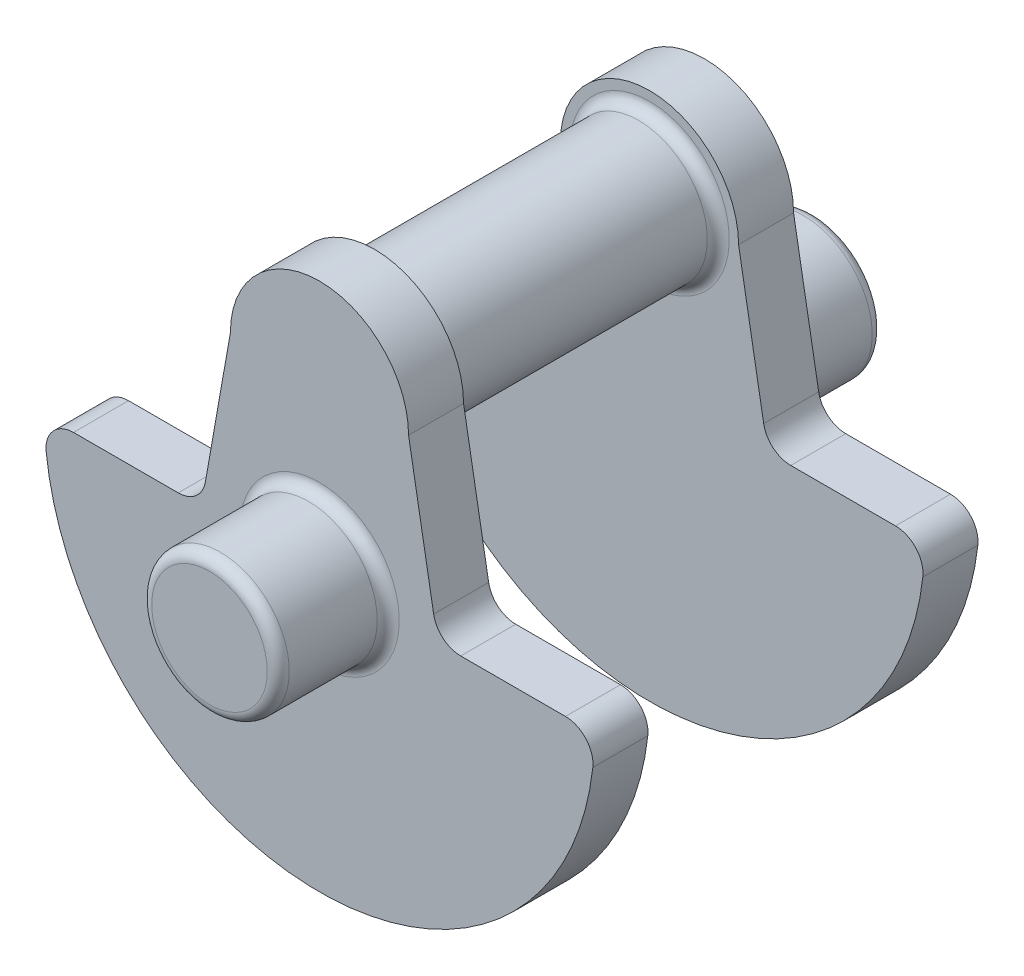
ISO-10303-21;
HEADER;
FILE_DESCRIPTION(('STEP AP214'),'2;1');
FILE_NAME('part.step','',(''),(''),'','','');
FILE_SCHEMA(('AUTOMOTIVE_DESIGN { 1 0 10303 214 1 1 1 1 }'));
ENDSEC;
DATA;
#1=APPLICATION_CONTEXT('core data for automotive mechanical design processes');
#2=APPLICATION_PROTOCOL_DEFINITION('international standard','automotive_design',2000,#1);
#3=PRODUCT_CONTEXT('',#1,'mechanical');
#4=PRODUCT('Part','Part','',(#3));
#5=PRODUCT_RELATED_PRODUCT_CATEGORY('part','',(#4));
#6=PRODUCT_DEFINITION_FORMATION('','',#4);
#7=PRODUCT_DEFINITION_CONTEXT('part definition',#1,'design');
#8=PRODUCT_DEFINITION('design','',#6,#7);
#9=PRODUCT_DEFINITION_SHAPE('','',#8);
#10=(LENGTH_UNIT() NAMED_UNIT(*) SI_UNIT(.MILLI.,.METRE.));
#11=(NAMED_UNIT(*) PLANE_ANGLE_UNIT() SI_UNIT($,.RADIAN.));
#12=(NAMED_UNIT(*) SI_UNIT($,.STERADIAN.) SOLID_ANGLE_UNIT());
#13=UNCERTAINTY_MEASURE_WITH_UNIT(LENGTH_MEASURE(1.E-05),#10,'distance_accuracy_value','');
#14=(GEOMETRIC_REPRESENTATION_CONTEXT(3) GLOBAL_UNCERTAINTY_ASSIGNED_CONTEXT((#13)) GLOBAL_UNIT_ASSIGNED_CONTEXT((#10,
#11,#12)) REPRESENTATION_CONTEXT('',''));
#15=CARTESIAN_POINT('',(0.,0.,0.));
#16=DIRECTION('',(0.,0.,1.));
#17=DIRECTION('',(1.,0.,0.));
#18=AXIS2_PLACEMENT_3D('',#15,#16,#17);
#19=CARTESIAN_POINT('',(0.,0.,-5.));
#20=DIRECTION('',(0.,0.,1.));
#21=DIRECTION('',(1.,0.,0.));
#22=AXIS2_PLACEMENT_3D('',#19,#20,#21);
#23=PLANE('',#22);
#24=CARTESIAN_POINT('',(0.,0.,-5.));
#25=DIRECTION('',(0.,0.,1.));
#26=DIRECTION('',(1.,0.,0.));
#27=AXIS2_PLACEMENT_3D('',#24,#25,#26);
#28=CIRCLE('',#27,14.5);
#29=CARTESIAN_POINT('',(14.5,0.,-5.));
#30=VERTEX_POINT('',#29);
#31=EDGE_CURVE('E340',#30,#30,#28,.T.);
#32=ORIENTED_EDGE('',*,*,#31,.T.);
#33=EDGE_LOOP('',(#32));
#34=FACE_BOUND('',#33,.T.);
#35=CARTESIAN_POINT('',(0.,-30.,-5.));
#36=DIRECTION('',(0.,0.,1.));
#37=DIRECTION('',(1.,0.,0.));
#38=AXIS2_PLACEMENT_3D('',#35,#36,#37);
#39=CIRCLE('',#38,50.);
#40=CARTESIAN_POINT('',(-49.6903994999953,-35.5555555555556,-5.));
#41=VERTEX_POINT('',#40);
#42=CARTESIAN_POINT('',(49.6903994999953,-35.5555555555556,-5.));
#43=VERTEX_POINT('',#42);
#44=EDGE_CURVE('E254',#41,#43,#39,.T.);
#45=ORIENTED_EDGE('',*,*,#44,.F.);
#46=CARTESIAN_POINT('',(-44.7213595499958,-35.,-5.));
#47=DIRECTION('',(0.,0.,1.));
#48=DIRECTION('',(1.,0.,0.));
#49=AXIS2_PLACEMENT_3D('',#46,#47,#48);
#50=CIRCLE('',#49,5.);
#51=CARTESIAN_POINT('',(-44.7213595499958,-30.,-5.));
#52=VERTEX_POINT('',#51);
#53=EDGE_CURVE('E293',#41,#52,#50,.F.);
#54=ORIENTED_EDGE('',*,*,#53,.T.);
#55=DIRECTION('',(-1.,0.,0.));
#56=VECTOR('',#55,1.);
#57=CARTESIAN_POINT('',(-50.,-30.,-5.));
#58=LINE('',#57,#56);
#59=CARTESIAN_POINT('',(-25.6794765631616,-30.,-5.));
#60=VERTEX_POINT('',#59);
#61=EDGE_CURVE('E251',#60,#52,#58,.T.);
#62=ORIENTED_EDGE('',*,*,#61,.F.);
#63=CARTESIAN_POINT('',(-25.6794765631616,-25.,-5.));
#64=DIRECTION('',(0.,0.,1.));
#65=DIRECTION('',(1.,0.,0.));
#66=AXIS2_PLACEMENT_3D('',#63,#64,#65);
#67=CIRCLE('',#66,5.);
#68=CARTESIAN_POINT('',(-20.7554377981006,-25.8682408883347,-5.));
#69=VERTEX_POINT('',#68);
#70=EDGE_CURVE('E323',#60,#69,#67,.T.);
#71=ORIENTED_EDGE('',*,*,#70,.T.);
#72=DIRECTION('',(-0.173648177666931,-0.984807753012208,0.));
#73=VECTOR('',#72,1.);
#74=CARTESIAN_POINT('',(-16.1941689860212,0.,-5.));
#75=LINE('',#74,#73);
#76=CARTESIAN_POINT('',(-16.1941689860212,0.,-5.));
#77=VERTEX_POINT('',#76);
#78=EDGE_CURVE('E248',#77,#69,#75,.T.);
#79=ORIENTED_EDGE('',*,*,#78,.F.);
#80=CARTESIAN_POINT('',(0.,0.,-5.));
#81=DIRECTION('',(0.,0.,1.));
#82=DIRECTION('',(1.,0.,0.));
#83=AXIS2_PLACEMENT_3D('',#80,#81,#82);
#84=CIRCLE('',#83,16.1941689860212);
#85=CARTESIAN_POINT('',(16.1941689860212,0.,-5.));
#86=VERTEX_POINT('',#85);
#87=EDGE_CURVE('E194',#86,#77,#84,.T.);
#88=ORIENTED_EDGE('',*,*,#87,.F.);
#89=DIRECTION('',(-0.173648177666931,0.984807753012208,0.));
#90=VECTOR('',#89,1.);
#91=CARTESIAN_POINT('',(16.1941689860212,0.,-5.));
#92=LINE('',#91,#90);
#93=CARTESIAN_POINT('',(20.7554377981006,-25.8682408883347,-5.));
#94=VERTEX_POINT('',#93);
#95=EDGE_CURVE('E232',#94,#86,#92,.T.);
#96=ORIENTED_EDGE('',*,*,#95,.F.);
#97=CARTESIAN_POINT('',(25.6794765631616,-25.,-5.));
#98=DIRECTION('',(0.,0.,1.));
#99=DIRECTION('',(1.,0.,0.));
#100=AXIS2_PLACEMENT_3D('',#97,#98,#99);
#101=CIRCLE('',#100,5.);
#102=CARTESIAN_POINT('',(25.6794765631616,-30.,-5.));
#103=VERTEX_POINT('',#102);
#104=EDGE_CURVE('E331',#94,#103,#101,.T.);
#105=ORIENTED_EDGE('',*,*,#104,.T.);
#106=DIRECTION('',(-1.,0.,0.));
#107=VECTOR('',#106,1.);
#108=CARTESIAN_POINT('',(21.4839784072752,-30.,-5.));
#109=LINE('',#108,#107);
#110=CARTESIAN_POINT('',(44.7213595499958,-30.,-5.));
#111=VERTEX_POINT('',#110);
#112=EDGE_CURVE('E257',#111,#103,#109,.T.);
#113=ORIENTED_EDGE('',*,*,#112,.F.);
#114=CARTESIAN_POINT('',(44.7213595499958,-35.,-5.));
#115=DIRECTION('',(0.,0.,1.));
#116=DIRECTION('',(1.,0.,0.));
#117=AXIS2_PLACEMENT_3D('',#114,#115,#116);
#118=CIRCLE('',#117,5.);
#119=EDGE_CURVE('E291',#111,#43,#118,.F.);
#120=ORIENTED_EDGE('',*,*,#119,.T.);
#121=EDGE_LOOP('',(#45,#54,#62,#71,#79,#88,#96,#105,#113,#120));
#122=FACE_BOUND('',#121,.T.);
#123=ADVANCED_FACE('F35',(#34,#122),#23,.F.);
#124=CARTESIAN_POINT('',(0.,0.,5.));
#125=DIRECTION('',(0.,0.,1.));
#126=DIRECTION('',(1.,0.,0.));
#127=AXIS2_PLACEMENT_3D('',#124,#125,#126);
#128=PLANE('',#127);
#129=CARTESIAN_POINT('',(0.,-30.,5.));
#130=DIRECTION('',(0.,0.,1.));
#131=DIRECTION('',(1.,0.,0.));
#132=AXIS2_PLACEMENT_3D('',#129,#130,#131);
#133=CIRCLE('',#132,14.5);
#134=CARTESIAN_POINT('',(14.5,-30.,5.));
#135=VERTEX_POINT('',#134);
#136=EDGE_CURVE('E11',#135,#135,#133,.F.);
#137=ORIENTED_EDGE('',*,*,#136,.T.);
#138=EDGE_LOOP('',(#137));
#139=FACE_BOUND('',#138,.T.);
#140=DIRECTION('',(-1.,0.,0.));
#141=VECTOR('',#140,1.);
#142=CARTESIAN_POINT('',(-50.,-30.,5.));
#143=LINE('',#142,#141);
#144=CARTESIAN_POINT('',(-25.6794765631616,-30.,5.));
#145=VERTEX_POINT('',#144);
#146=CARTESIAN_POINT('',(-44.7213595499958,-30.,5.));
#147=VERTEX_POINT('',#146);
#148=EDGE_CURVE('E235',#145,#147,#143,.T.);
#149=ORIENTED_EDGE('',*,*,#148,.T.);
#150=CARTESIAN_POINT('',(-44.7213595499958,-35.,5.));
#151=DIRECTION('',(0.,0.,1.));
#152=DIRECTION('',(1.,0.,0.));
#153=AXIS2_PLACEMENT_3D('',#150,#151,#152);
#154=CIRCLE('',#153,5.);
#155=CARTESIAN_POINT('',(-49.6903994999953,-35.5555555555556,5.));
#156=VERTEX_POINT('',#155);
#157=EDGE_CURVE('E302',#147,#156,#154,.T.);
#158=ORIENTED_EDGE('',*,*,#157,.T.);
#159=CARTESIAN_POINT('',(0.,-30.,5.));
#160=DIRECTION('',(0.,0.,1.));
#161=DIRECTION('',(1.,0.,0.));
#162=AXIS2_PLACEMENT_3D('',#159,#160,#161);
#163=CIRCLE('',#162,50.);
#164=CARTESIAN_POINT('',(49.6903994999953,-35.5555555555556,5.));
#165=VERTEX_POINT('',#164);
#166=EDGE_CURVE('E238',#156,#165,#163,.T.);
#167=ORIENTED_EDGE('',*,*,#166,.T.);
#168=CARTESIAN_POINT('',(44.7213595499958,-35.,5.));
#169=DIRECTION('',(0.,0.,1.));
#170=DIRECTION('',(1.,0.,0.));
#171=AXIS2_PLACEMENT_3D('',#168,#169,#170);
#172=CIRCLE('',#171,5.);
#173=CARTESIAN_POINT('',(44.7213595499958,-30.,5.));
#174=VERTEX_POINT('',#173);
#175=EDGE_CURVE('E300',#165,#174,#172,.T.);
#176=ORIENTED_EDGE('',*,*,#175,.T.);
#177=DIRECTION('',(-1.,0.,0.));
#178=VECTOR('',#177,1.);
#179=CARTESIAN_POINT('',(21.4839784072752,-30.,5.));
#180=LINE('',#179,#178);
#181=CARTESIAN_POINT('',(25.6794765631616,-30.,5.));
#182=VERTEX_POINT('',#181);
#183=EDGE_CURVE('E241',#174,#182,#180,.T.);
#184=ORIENTED_EDGE('',*,*,#183,.T.);
#185=CARTESIAN_POINT('',(25.6794765631616,-25.,5.));
#186=DIRECTION('',(0.,0.,1.));
#187=DIRECTION('',(1.,0.,0.));
#188=AXIS2_PLACEMENT_3D('',#185,#186,#187);
#189=CIRCLE('',#188,5.);
#190=CARTESIAN_POINT('',(20.7554377981006,-25.8682408883347,5.));
#191=VERTEX_POINT('',#190);
#192=EDGE_CURVE('E50',#182,#191,#189,.F.);
#193=ORIENTED_EDGE('',*,*,#192,.T.);
#194=DIRECTION('',(-0.173648177666931,0.984807753012208,0.));
#195=VECTOR('',#194,1.);
#196=CARTESIAN_POINT('',(16.1941689860212,0.,5.));
#197=LINE('',#196,#195);
#198=CARTESIAN_POINT('',(16.1941689860212,0.,5.));
#199=VERTEX_POINT('',#198);
#200=EDGE_CURVE('E243',#191,#199,#197,.T.);
#201=ORIENTED_EDGE('',*,*,#200,.T.);
#202=CARTESIAN_POINT('',(0.,0.,5.));
#203=DIRECTION('',(0.,0.,1.));
#204=DIRECTION('',(1.,0.,0.));
#205=AXIS2_PLACEMENT_3D('',#202,#203,#204);
#206=CIRCLE('',#205,16.1941689860212);
#207=CARTESIAN_POINT('',(-16.1941689860212,0.,5.));
#208=VERTEX_POINT('',#207);
#209=EDGE_CURVE('E228',#199,#208,#206,.T.);
#210=ORIENTED_EDGE('',*,*,#209,.T.);
#211=DIRECTION('',(-0.173648177666931,-0.984807753012208,0.));
#212=VECTOR('',#211,1.);
#213=CARTESIAN_POINT('',(-16.1941689860212,0.,5.));
#214=LINE('',#213,#212);
#215=CARTESIAN_POINT('',(-20.7554377981006,-25.8682408883347,5.));
#216=VERTEX_POINT('',#215);
#217=EDGE_CURVE('E231',#208,#216,#214,.T.);
#218=ORIENTED_EDGE('',*,*,#217,.T.);
#219=CARTESIAN_POINT('',(-25.6794765631616,-25.,5.));
#220=DIRECTION('',(0.,0.,1.));
#221=DIRECTION('',(1.,0.,0.));
#222=AXIS2_PLACEMENT_3D('',#219,#220,#221);
#223=CIRCLE('',#222,5.);
#224=EDGE_CURVE('E325',#216,#145,#223,.F.);
#225=ORIENTED_EDGE('',*,*,#224,.T.);
#226=EDGE_LOOP('',(#149,#158,#167,#176,#184,#193,#201,#210,#218,#225));
#227=FACE_BOUND('',#226,.T.);
#228=ADVANCED_FACE('F389',(#139,#227),#128,.T.);
#229=CARTESIAN_POINT('',(0.,0.,5.));
#230=DIRECTION('',(0.,0.,-1.));
#231=DIRECTION('',(-1.,0.,0.));
#232=AXIS2_PLACEMENT_3D('',#229,#230,#231);
#233=CYLINDRICAL_SURFACE('',#232,16.1941689860212);
#234=ORIENTED_EDGE('',*,*,#87,.T.);
#235=DIRECTION('',(0.,0.,-1.));
#236=VECTOR('',#235,1.);
#237=CARTESIAN_POINT('',(-16.1941689860212,0.,5.));
#238=LINE('',#237,#236);
#239=EDGE_CURVE('E262',#208,#77,#238,.T.);
#240=ORIENTED_EDGE('',*,*,#239,.F.);
#241=ORIENTED_EDGE('',*,*,#209,.F.);
#242=DIRECTION('',(0.,0.,-1.));
#243=VECTOR('',#242,1.);
#244=CARTESIAN_POINT('',(16.1941689860212,0.,5.));
#245=LINE('',#244,#243);
#246=EDGE_CURVE('E245',#199,#86,#245,.T.);
#247=ORIENTED_EDGE('',*,*,#246,.T.);
#248=EDGE_LOOP('',(#234,#240,#241,#247));
#249=FACE_BOUND('',#248,.T.);
#250=ADVANCED_FACE('F395',(#249),#233,.T.);
#251=CARTESIAN_POINT('',(-16.1941689860212,0.,5.));
#252=DIRECTION('',(0.984807753012208,-0.173648177666931,0.));
#253=DIRECTION('',(0.173648177666931,0.984807753012208,0.));
#254=AXIS2_PLACEMENT_3D('',#251,#252,#253);
#255=PLANE('',#254);
#256=ORIENTED_EDGE('',*,*,#78,.T.);
#257=DIRECTION('',(0.,0.,-1.));
#258=VECTOR('',#257,1.);
#259=CARTESIAN_POINT('',(-20.7554377981006,-25.8682408883347,5.));
#260=LINE('',#259,#258);
#261=EDGE_CURVE('E304',#69,#216,#260,.F.);
#262=ORIENTED_EDGE('',*,*,#261,.T.);
#263=ORIENTED_EDGE('',*,*,#217,.F.);
#264=ORIENTED_EDGE('',*,*,#239,.T.);
#265=EDGE_LOOP('',(#256,#262,#263,#264));
#266=FACE_BOUND('',#265,.T.);
#267=ADVANCED_FACE('F413',(#266),#255,.F.);
#268=CARTESIAN_POINT('',(-50.,-30.,5.));
#269=DIRECTION('',(0.,-1.,0.));
#270=DIRECTION('',(0.,0.,-1.));
#271=AXIS2_PLACEMENT_3D('',#268,#269,#270);
#272=PLANE('',#271);
#273=ORIENTED_EDGE('',*,*,#61,.T.);
#274=DIRECTION('',(0.,0.,-1.));
#275=VECTOR('',#274,1.);
#276=CARTESIAN_POINT('',(-44.7213595499958,-30.,5.));
#277=LINE('',#276,#275);
#278=EDGE_CURVE('E298',#52,#147,#277,.F.);
#279=ORIENTED_EDGE('',*,*,#278,.T.);
#280=ORIENTED_EDGE('',*,*,#148,.F.);
#281=DIRECTION('',(0.,0.,-1.));
#282=VECTOR('',#281,1.);
#283=CARTESIAN_POINT('',(-25.6794765631616,-30.,-5.));
#284=LINE('',#283,#282);
#285=EDGE_CURVE('E295',#145,#60,#284,.T.);
#286=ORIENTED_EDGE('',*,*,#285,.T.);
#287=EDGE_LOOP('',(#273,#279,#280,#286));
#288=FACE_BOUND('',#287,.T.);
#289=ADVANCED_FACE('F409',(#288),#272,.F.);
#290=CARTESIAN_POINT('',(0.,-30.,5.));
#291=DIRECTION('',(0.,0.,-1.));
#292=DIRECTION('',(-1.,0.,0.));
#293=AXIS2_PLACEMENT_3D('',#290,#291,#292);
#294=CYLINDRICAL_SURFACE('',#293,50.);
#295=ORIENTED_EDGE('',*,*,#166,.F.);
#296=DIRECTION('',(0.,0.,-1.));
#297=VECTOR('',#296,1.);
#298=CARTESIAN_POINT('',(-49.6903994999953,-35.5555555555556,5.));
#299=LINE('',#298,#297);
#300=EDGE_CURVE('E288',#156,#41,#299,.T.);
#301=ORIENTED_EDGE('',*,*,#300,.T.);
#302=ORIENTED_EDGE('',*,*,#44,.T.);
#303=DIRECTION('',(0.,0.,-1.));
#304=VECTOR('',#303,1.);
#305=CARTESIAN_POINT('',(49.6903994999953,-35.5555555555556,5.));
#306=LINE('',#305,#304);
#307=EDGE_CURVE('E286',#43,#165,#306,.F.);
#308=ORIENTED_EDGE('',*,*,#307,.T.);
#309=EDGE_LOOP('',(#295,#301,#302,#308));
#310=FACE_BOUND('',#309,.T.);
#311=ADVANCED_FACE('F406',(#310),#294,.T.);
#312=CARTESIAN_POINT('',(21.4839784072752,-30.,5.));
#313=DIRECTION('',(0.,-1.,0.));
#314=DIRECTION('',(1.,0.,0.));
#315=AXIS2_PLACEMENT_3D('',#312,#313,#314);
#316=PLANE('',#315);
#317=ORIENTED_EDGE('',*,*,#183,.F.);
#318=DIRECTION('',(0.,0.,-1.));
#319=VECTOR('',#318,1.);
#320=CARTESIAN_POINT('',(44.7213595499958,-30.,5.));
#321=LINE('',#320,#319);
#322=EDGE_CURVE('E313',#174,#111,#321,.T.);
#323=ORIENTED_EDGE('',*,*,#322,.T.);
#324=ORIENTED_EDGE('',*,*,#112,.T.);
#325=DIRECTION('',(0.,0.,-1.));
#326=VECTOR('',#325,1.);
#327=CARTESIAN_POINT('',(25.6794765631616,-30.,5.));
#328=LINE('',#327,#326);
#329=EDGE_CURVE('E58',#103,#182,#328,.F.);
#330=ORIENTED_EDGE('',*,*,#329,.T.);
#331=EDGE_LOOP('',(#317,#323,#324,#330));
#332=FACE_BOUND('',#331,.T.);
#333=ADVANCED_FACE('F402',(#332),#316,.F.);
#334=CARTESIAN_POINT('',(16.1941689860212,0.,5.));
#335=DIRECTION('',(-0.984807753012208,-0.173648177666931,0.));
#336=DIRECTION('',(0.173648177666931,-0.984807753012208,0.));
#337=AXIS2_PLACEMENT_3D('',#334,#335,#336);
#338=PLANE('',#337);
#339=ORIENTED_EDGE('',*,*,#200,.F.);
#340=DIRECTION('',(0.,0.,-1.));
#341=VECTOR('',#340,1.);
#342=CARTESIAN_POINT('',(20.7554377981006,-25.8682408883346,-5.));
#343=LINE('',#342,#341);
#344=EDGE_CURVE('E316',#191,#94,#343,.T.);
#345=ORIENTED_EDGE('',*,*,#344,.T.);
#346=ORIENTED_EDGE('',*,*,#95,.T.);
#347=ORIENTED_EDGE('',*,*,#246,.F.);
#348=EDGE_LOOP('',(#339,#345,#346,#347));
#349=FACE_BOUND('',#348,.T.);
#350=ADVANCED_FACE('F386',(#349),#338,.F.);
#351=CARTESIAN_POINT('',(0.,-30.,25.));
#352=DIRECTION('',(0.,0.,-1.));
#353=DIRECTION('',(-1.,0.,0.));
#354=AXIS2_PLACEMENT_3D('',#351,#352,#353);
#355=CYLINDRICAL_SURFACE('',#354,12.5);
#356=CARTESIAN_POINT('',(0.,-30.,23.));
#357=DIRECTION('',(0.,0.,1.));
#358=DIRECTION('',(1.,0.,0.));
#359=AXIS2_PLACEMENT_3D('',#356,#357,#358);
#360=CIRCLE('',#359,12.5);
#361=CARTESIAN_POINT('',(12.5,-30.,23.));
#362=VERTEX_POINT('',#361);
#363=EDGE_CURVE('E43',#362,#362,#360,.F.);
#364=ORIENTED_EDGE('',*,*,#363,.T.);
#365=EDGE_LOOP('',(#364));
#366=FACE_BOUND('',#365,.T.);
#367=CARTESIAN_POINT('',(0.,-30.,7.));
#368=DIRECTION('',(0.,0.,1.));
#369=DIRECTION('',(1.,0.,0.));
#370=AXIS2_PLACEMENT_3D('',#367,#368,#369);
#371=CIRCLE('',#370,12.5);
#372=CARTESIAN_POINT('',(12.5,-30.,7.));
#373=VERTEX_POINT('',#372);
#374=EDGE_CURVE('E361',#373,#373,#371,.T.);
#375=ORIENTED_EDGE('',*,*,#374,.T.);
#376=EDGE_LOOP('',(#375));
#377=FACE_BOUND('',#376,.T.);
#378=ADVANCED_FACE('F366',(#366,#377),#355,.T.);
#379=CARTESIAN_POINT('',(0.,-30.,25.));
#380=DIRECTION('',(0.,0.,1.));
#381=DIRECTION('',(1.,0.,0.));
#382=AXIS2_PLACEMENT_3D('',#379,#380,#381);
#383=PLANE('',#382);
#384=CARTESIAN_POINT('',(0.,-30.,25.));
#385=DIRECTION('',(0.,0.,1.));
#386=DIRECTION('',(1.,0.,0.));
#387=AXIS2_PLACEMENT_3D('',#384,#385,#386);
#388=CIRCLE('',#387,10.5);
#389=CARTESIAN_POINT('',(10.5,-30.,25.));
#390=VERTEX_POINT('',#389);
#391=EDGE_CURVE('E358',#390,#390,#388,.T.);
#392=ORIENTED_EDGE('',*,*,#391,.T.);
#393=EDGE_LOOP('',(#392));
#394=FACE_BOUND('',#393,.T.);
#395=ADVANCED_FACE('F375',(#394),#383,.T.);
#396=CARTESIAN_POINT('',(0.,0.,-55.));
#397=DIRECTION('',(0.,0.,1.));
#398=DIRECTION('',(1.,0.,0.));
#399=AXIS2_PLACEMENT_3D('',#396,#397,#398);
#400=CYLINDRICAL_SURFACE('',#399,12.5);
#401=CARTESIAN_POINT('',(0.,0.,-7.));
#402=DIRECTION('',(0.,0.,1.));
#403=DIRECTION('',(1.,0.,0.));
#404=AXIS2_PLACEMENT_3D('',#401,#402,#403);
#405=CIRCLE('',#404,12.5);
#406=CARTESIAN_POINT('',(12.5,0.,-7.));
#407=VERTEX_POINT('',#406);
#408=EDGE_CURVE('E337',#407,#407,#405,.F.);
#409=ORIENTED_EDGE('',*,*,#408,.T.);
#410=EDGE_LOOP('',(#409));
#411=FACE_BOUND('',#410,.T.);
#412=CARTESIAN_POINT('',(0.,0.,-53.));
#413=DIRECTION('',(0.,0.,-1.));
#414=DIRECTION('',(-1.,0.,0.));
#415=AXIS2_PLACEMENT_3D('',#412,#413,#414);
#416=CIRCLE('',#415,12.5);
#417=CARTESIAN_POINT('',(-12.5,0.,-53.));
#418=VERTEX_POINT('',#417);
#419=EDGE_CURVE('E334',#418,#418,#416,.F.);
#420=ORIENTED_EDGE('',*,*,#419,.T.);
#421=EDGE_LOOP('',(#420));
#422=FACE_BOUND('',#421,.T.);
#423=ADVANCED_FACE('F377',(#411,#422),#400,.T.);
#424=CARTESIAN_POINT('',(0.,0.,-55.));
#425=DIRECTION('',(0.,0.,-1.));
#426=DIRECTION('',(1.,0.,0.));
#427=AXIS2_PLACEMENT_3D('',#424,#425,#426);
#428=PLANE('',#427);
#429=CARTESIAN_POINT('',(0.,0.,-55.));
#430=DIRECTION('',(0.,0.,-1.));
#431=DIRECTION('',(-1.,0.,0.));
#432=AXIS2_PLACEMENT_3D('',#429,#430,#431);
#433=CIRCLE('',#432,14.5);
#434=CARTESIAN_POINT('',(-14.5,0.,-55.));
#435=VERTEX_POINT('',#434);
#436=EDGE_CURVE('E343',#435,#435,#433,.T.);
#437=ORIENTED_EDGE('',*,*,#436,.T.);
#438=EDGE_LOOP('',(#437));
#439=FACE_BOUND('',#438,.T.);
#440=DIRECTION('',(-1.,0.,0.));
#441=VECTOR('',#440,1.);
#442=CARTESIAN_POINT('',(-50.,-30.,-55.));
#443=LINE('',#442,#441);
#444=CARTESIAN_POINT('',(-25.6794765631616,-30.,-55.));
#445=VERTEX_POINT('',#444);
#446=CARTESIAN_POINT('',(-44.7213595499958,-30.,-55.));
#447=VERTEX_POINT('',#446);
#448=EDGE_CURVE('E204',#445,#447,#443,.T.);
#449=ORIENTED_EDGE('',*,*,#448,.T.);
#450=CARTESIAN_POINT('',(-44.7213595499958,-35.,-55.));
#451=DIRECTION('',(0.,0.,-1.));
#452=DIRECTION('',(-1.,0.,0.));
#453=AXIS2_PLACEMENT_3D('',#450,#451,#452);
#454=CIRCLE('',#453,5.);
#455=CARTESIAN_POINT('',(-49.6903994999953,-35.5555555555556,-55.));
#456=VERTEX_POINT('',#455);
#457=EDGE_CURVE('E275',#447,#456,#454,.F.);
#458=ORIENTED_EDGE('',*,*,#457,.T.);
#459=CARTESIAN_POINT('',(0.,-30.,-55.));
#460=DIRECTION('',(0.,0.,1.));
#461=DIRECTION('',(1.,0.,0.));
#462=AXIS2_PLACEMENT_3D('',#459,#460,#461);
#463=CIRCLE('',#462,50.);
#464=CARTESIAN_POINT('',(49.6903994999953,-35.5555555555556,-55.));
#465=VERTEX_POINT('',#464);
#466=EDGE_CURVE('E222',#456,#465,#463,.T.);
#467=ORIENTED_EDGE('',*,*,#466,.T.);
#468=CARTESIAN_POINT('',(44.7213595499958,-35.,-55.));
#469=DIRECTION('',(0.,0.,-1.));
#470=DIRECTION('',(-1.,0.,0.));
#471=AXIS2_PLACEMENT_3D('',#468,#469,#470);
#472=CIRCLE('',#471,5.);
#473=CARTESIAN_POINT('',(44.7213595499958,-30.,-55.));
#474=VERTEX_POINT('',#473);
#475=EDGE_CURVE('E273',#465,#474,#472,.F.);
#476=ORIENTED_EDGE('',*,*,#475,.T.);
#477=DIRECTION('',(-1.,0.,0.));
#478=VECTOR('',#477,1.);
#479=CARTESIAN_POINT('',(21.4839784072752,-30.,-55.));
#480=LINE('',#479,#478);
#481=CARTESIAN_POINT('',(25.6794765631616,-30.,-55.));
#482=VERTEX_POINT('',#481);
#483=EDGE_CURVE('E219',#474,#482,#480,.T.);
#484=ORIENTED_EDGE('',*,*,#483,.T.);
#485=CARTESIAN_POINT('',(25.6794765631616,-25.,-55.));
#486=DIRECTION('',(0.,0.,-1.));
#487=DIRECTION('',(-1.,0.,0.));
#488=AXIS2_PLACEMENT_3D('',#485,#486,#487);
#489=CIRCLE('',#488,5.);
#490=CARTESIAN_POINT('',(20.7554377981006,-25.8682408883347,-55.));
#491=VERTEX_POINT('',#490);
#492=EDGE_CURVE('E327',#482,#491,#489,.T.);
#493=ORIENTED_EDGE('',*,*,#492,.T.);
#494=DIRECTION('',(-0.173648177666931,0.984807753012208,0.));
#495=VECTOR('',#494,1.);
#496=CARTESIAN_POINT('',(16.1941689860212,0.,-55.));
#497=LINE('',#496,#495);
#498=CARTESIAN_POINT('',(16.1941689860212,0.,-55.));
#499=VERTEX_POINT('',#498);
#500=EDGE_CURVE('E217',#491,#499,#497,.T.);
#501=ORIENTED_EDGE('',*,*,#500,.T.);
#502=CARTESIAN_POINT('',(0.,0.,-55.));
#503=DIRECTION('',(0.,0.,1.));
#504=DIRECTION('',(1.,0.,0.));
#505=AXIS2_PLACEMENT_3D('',#502,#503,#504);
#506=CIRCLE('',#505,16.1941689860212);
#507=CARTESIAN_POINT('',(-16.1941689860212,0.,-55.));
#508=VERTEX_POINT('',#507);
#509=EDGE_CURVE('E193',#499,#508,#506,.T.);
#510=ORIENTED_EDGE('',*,*,#509,.T.);
#511=DIRECTION('',(-0.173648177666931,-0.984807753012208,0.));
#512=VECTOR('',#511,1.);
#513=CARTESIAN_POINT('',(-16.1941689860212,0.,-55.));
#514=LINE('',#513,#512);
#515=CARTESIAN_POINT('',(-20.7554377981006,-25.8682408883347,-55.));
#516=VERTEX_POINT('',#515);
#517=EDGE_CURVE('E201',#508,#516,#514,.T.);
#518=ORIENTED_EDGE('',*,*,#517,.T.);
#519=CARTESIAN_POINT('',(-25.6794765631616,-25.,-55.));
#520=DIRECTION('',(0.,0.,-1.));
#521=DIRECTION('',(-1.,0.,0.));
#522=AXIS2_PLACEMENT_3D('',#519,#520,#521);
#523=CIRCLE('',#522,5.);
#524=EDGE_CURVE('E319',#516,#445,#523,.T.);
#525=ORIENTED_EDGE('',*,*,#524,.T.);
#526=EDGE_LOOP('',(#449,#458,#467,#476,#484,#493,#501,#510,#518,#525));
#527=FACE_BOUND('',#526,.T.);
#528=ADVANCED_FACE('F383',(#439,#527),#428,.F.);
#529=CARTESIAN_POINT('',(0.,0.,-65.));
#530=DIRECTION('',(0.,0.,1.));
#531=DIRECTION('',(1.,0.,0.));
#532=AXIS2_PLACEMENT_3D('',#529,#530,#531);
#533=CYLINDRICAL_SURFACE('',#532,16.1941689860212);
#534=ORIENTED_EDGE('',*,*,#509,.F.);
#535=DIRECTION('',(0.,0.,1.));
#536=VECTOR('',#535,1.);
#537=CARTESIAN_POINT('',(16.1941689860212,0.,-65.));
#538=LINE('',#537,#536);
#539=CARTESIAN_POINT('',(16.1941689860212,0.,-65.));
#540=VERTEX_POINT('',#539);
#541=EDGE_CURVE('E178',#540,#499,#538,.T.);
#542=ORIENTED_EDGE('',*,*,#541,.F.);
#543=CARTESIAN_POINT('',(0.,0.,-65.));
#544=DIRECTION('',(0.,0.,1.));
#545=DIRECTION('',(1.,0.,0.));
#546=AXIS2_PLACEMENT_3D('',#543,#544,#545);
#547=CIRCLE('',#546,16.1941689860212);
#548=CARTESIAN_POINT('',(-16.1941689860212,0.,-65.));
#549=VERTEX_POINT('',#548);
#550=EDGE_CURVE('E186',#540,#549,#547,.T.);
#551=ORIENTED_EDGE('',*,*,#550,.T.);
#552=DIRECTION('',(0.,0.,1.));
#553=VECTOR('',#552,1.);
#554=CARTESIAN_POINT('',(-16.1941689860212,0.,-65.));
#555=LINE('',#554,#553);
#556=EDGE_CURVE('E195',#549,#508,#555,.T.);
#557=ORIENTED_EDGE('',*,*,#556,.T.);
#558=EDGE_LOOP('',(#534,#542,#551,#557));
#559=FACE_BOUND('',#558,.T.);
#560=ADVANCED_FACE('F190',(#559),#533,.T.);
#561=CARTESIAN_POINT('',(16.1941689860212,0.,-65.));
#562=DIRECTION('',(0.984807753012208,0.173648177666931,0.));
#563=DIRECTION('',(-0.173648177666931,0.984807753012208,0.));
#564=AXIS2_PLACEMENT_3D('',#561,#562,#563);
#565=PLANE('',#564);
#566=ORIENTED_EDGE('',*,*,#500,.F.);
#567=DIRECTION('',(0.,0.,1.));
#568=VECTOR('',#567,1.);
#569=CARTESIAN_POINT('',(20.7554377981006,-25.8682408883346,-65.));
#570=LINE('',#569,#568);
#571=CARTESIAN_POINT('',(20.7554377981006,-25.8682408883347,-65.));
#572=VERTEX_POINT('',#571);
#573=EDGE_CURVE('E181',#491,#572,#570,.F.);
#574=ORIENTED_EDGE('',*,*,#573,.T.);
#575=DIRECTION('',(-0.173648177666931,0.984807753012208,0.));
#576=VECTOR('',#575,1.);
#577=CARTESIAN_POINT('',(16.1941689860212,0.,-65.));
#578=LINE('',#577,#576);
#579=EDGE_CURVE('E174',#572,#540,#578,.T.);
#580=ORIENTED_EDGE('',*,*,#579,.T.);
#581=ORIENTED_EDGE('',*,*,#541,.T.);
#582=EDGE_LOOP('',(#566,#574,#580,#581));
#583=FACE_BOUND('',#582,.T.);
#584=ADVANCED_FACE('F177',(#583),#565,.T.);
#585=CARTESIAN_POINT('',(21.4839784072752,-30.,-65.));
#586=DIRECTION('',(0.,1.,0.));
#587=DIRECTION('',(-1.,0.,0.));
#588=AXIS2_PLACEMENT_3D('',#585,#586,#587);
#589=PLANE('',#588);
#590=DIRECTION('',(-1.,0.,0.));
#591=VECTOR('',#590,1.);
#592=CARTESIAN_POINT('',(21.4839784072752,-30.,-65.));
#593=LINE('',#592,#591);
#594=CARTESIAN_POINT('',(44.7213595499958,-30.,-65.));
#595=VERTEX_POINT('',#594);
#596=CARTESIAN_POINT('',(25.6794765631616,-30.,-65.));
#597=VERTEX_POINT('',#596);
#598=EDGE_CURVE('E185',#595,#597,#593,.T.);
#599=ORIENTED_EDGE('',*,*,#598,.T.);
#600=DIRECTION('',(0.,0.,1.));
#601=VECTOR('',#600,1.);
#602=CARTESIAN_POINT('',(25.6794765631616,-30.,-55.));
#603=LINE('',#602,#601);
#604=EDGE_CURVE('E308',#597,#482,#603,.T.);
#605=ORIENTED_EDGE('',*,*,#604,.T.);
#606=ORIENTED_EDGE('',*,*,#483,.F.);
#607=DIRECTION('',(0.,0.,1.));
#608=VECTOR('',#607,1.);
#609=CARTESIAN_POINT('',(44.7213595499958,-30.,-65.));
#610=LINE('',#609,#608);
#611=EDGE_CURVE('E306',#474,#595,#610,.F.);
#612=ORIENTED_EDGE('',*,*,#611,.T.);
#613=EDGE_LOOP('',(#599,#605,#606,#612));
#614=FACE_BOUND('',#613,.T.);
#615=ADVANCED_FACE('F501',(#614),#589,.T.);
#616=CARTESIAN_POINT('',(0.,-30.,-65.));
#617=DIRECTION('',(0.,0.,1.));
#618=DIRECTION('',(1.,0.,0.));
#619=AXIS2_PLACEMENT_3D('',#616,#617,#618);
#620=CYLINDRICAL_SURFACE('',#619,50.);
#621=ORIENTED_EDGE('',*,*,#466,.F.);
#622=DIRECTION('',(0.,0.,1.));
#623=VECTOR('',#622,1.);
#624=CARTESIAN_POINT('',(-49.6903994999953,-35.5555555555556,-65.));
#625=LINE('',#624,#623);
#626=CARTESIAN_POINT('',(-49.6903994999953,-35.5555555555556,-65.));
#627=VERTEX_POINT('',#626);
#628=EDGE_CURVE('E280',#456,#627,#625,.F.);
#629=ORIENTED_EDGE('',*,*,#628,.T.);
#630=CARTESIAN_POINT('',(0.,-30.,-65.));
#631=DIRECTION('',(0.,0.,1.));
#632=DIRECTION('',(1.,0.,0.));
#633=AXIS2_PLACEMENT_3D('',#630,#631,#632);
#634=CIRCLE('',#633,50.);
#635=CARTESIAN_POINT('',(49.6903994999953,-35.5555555555556,-65.));
#636=VERTEX_POINT('',#635);
#637=EDGE_CURVE('E209',#627,#636,#634,.T.);
#638=ORIENTED_EDGE('',*,*,#637,.T.);
#639=DIRECTION('',(0.,0.,1.));
#640=VECTOR('',#639,1.);
#641=CARTESIAN_POINT('',(49.6903994999953,-35.5555555555556,-65.));
#642=LINE('',#641,#640);
#643=EDGE_CURVE('E277',#636,#465,#642,.T.);
#644=ORIENTED_EDGE('',*,*,#643,.T.);
#645=EDGE_LOOP('',(#621,#629,#638,#644));
#646=FACE_BOUND('',#645,.T.);
#647=ADVANCED_FACE('F497',(#646),#620,.T.);
#648=CARTESIAN_POINT('',(-50.,-30.,-65.));
#649=DIRECTION('',(0.,1.,0.));
#650=DIRECTION('',(0.,0.,1.));
#651=AXIS2_PLACEMENT_3D('',#648,#649,#650);
#652=PLANE('',#651);
#653=ORIENTED_EDGE('',*,*,#448,.F.);
#654=DIRECTION('',(0.,0.,1.));
#655=VECTOR('',#654,1.);
#656=CARTESIAN_POINT('',(-25.6794765631616,-30.,-65.));
#657=LINE('',#656,#655);
#658=CARTESIAN_POINT('',(-25.6794765631616,-30.,-65.));
#659=VERTEX_POINT('',#658);
#660=EDGE_CURVE('E271',#445,#659,#657,.F.);
#661=ORIENTED_EDGE('',*,*,#660,.T.);
#662=DIRECTION('',(-1.,0.,0.));
#663=VECTOR('',#662,1.);
#664=CARTESIAN_POINT('',(-50.,-30.,-65.));
#665=LINE('',#664,#663);
#666=CARTESIAN_POINT('',(-44.7213595499958,-30.,-65.));
#667=VERTEX_POINT('',#666);
#668=EDGE_CURVE('E212',#659,#667,#665,.T.);
#669=ORIENTED_EDGE('',*,*,#668,.T.);
#670=DIRECTION('',(0.,0.,1.));
#671=VECTOR('',#670,1.);
#672=CARTESIAN_POINT('',(-44.7213595499958,-30.,-65.));
#673=LINE('',#672,#671);
#674=EDGE_CURVE('E268',#667,#447,#673,.T.);
#675=ORIENTED_EDGE('',*,*,#674,.T.);
#676=EDGE_LOOP('',(#653,#661,#669,#675));
#677=FACE_BOUND('',#676,.T.);
#678=ADVANCED_FACE('F493',(#677),#652,.T.);
#679=CARTESIAN_POINT('',(-16.1941689860212,0.,-65.));
#680=DIRECTION('',(-0.984807753012208,0.173648177666931,0.));
#681=DIRECTION('',(-0.173648177666931,-0.984807753012208,0.));
#682=AXIS2_PLACEMENT_3D('',#679,#680,#681);
#683=PLANE('',#682);
#684=DIRECTION('',(-0.173648177666931,-0.984807753012208,0.));
#685=VECTOR('',#684,1.);
#686=CARTESIAN_POINT('',(-16.1941689860212,0.,-65.));
#687=LINE('',#686,#685);
#688=CARTESIAN_POINT('',(-20.7554377981006,-25.8682408883347,-65.));
#689=VERTEX_POINT('',#688);
#690=EDGE_CURVE('E200',#549,#689,#687,.T.);
#691=ORIENTED_EDGE('',*,*,#690,.T.);
#692=DIRECTION('',(0.,0.,1.));
#693=VECTOR('',#692,1.);
#694=CARTESIAN_POINT('',(-20.7554377981006,-25.8682408883347,-55.));
#695=LINE('',#694,#693);
#696=EDGE_CURVE('E265',#689,#516,#695,.T.);
#697=ORIENTED_EDGE('',*,*,#696,.T.);
#698=ORIENTED_EDGE('',*,*,#517,.F.);
#699=ORIENTED_EDGE('',*,*,#556,.F.);
#700=EDGE_LOOP('',(#691,#697,#698,#699));
#701=FACE_BOUND('',#700,.T.);
#702=ADVANCED_FACE('F484',(#701),#683,.T.);
#703=CARTESIAN_POINT('',(0.,0.,-65.));
#704=DIRECTION('',(0.,0.,-1.));
#705=DIRECTION('',(1.,0.,0.));
#706=AXIS2_PLACEMENT_3D('',#703,#704,#705);
#707=PLANE('',#706);
#708=CARTESIAN_POINT('',(0.,-30.,-65.));
#709=DIRECTION('',(0.,0.,-1.));
#710=DIRECTION('',(-1.,0.,0.));
#711=AXIS2_PLACEMENT_3D('',#708,#709,#710);
#712=CIRCLE('',#711,14.5);
#713=CARTESIAN_POINT('',(-14.5,-30.,-65.));
#714=VERTEX_POINT('',#713);
#715=EDGE_CURVE('E355',#714,#714,#712,.F.);
#716=ORIENTED_EDGE('',*,*,#715,.T.);
#717=EDGE_LOOP('',(#716));
#718=FACE_BOUND('',#717,.T.);
#719=ORIENTED_EDGE('',*,*,#637,.F.);
#720=CARTESIAN_POINT('',(-44.7213595499958,-35.,-65.));
#721=DIRECTION('',(0.,0.,-1.));
#722=DIRECTION('',(-1.,0.,0.));
#723=AXIS2_PLACEMENT_3D('',#720,#721,#722);
#724=CIRCLE('',#723,5.);
#725=EDGE_CURVE('E284',#627,#667,#724,.T.);
#726=ORIENTED_EDGE('',*,*,#725,.T.);
#727=ORIENTED_EDGE('',*,*,#668,.F.);
#728=CARTESIAN_POINT('',(-25.6794765631616,-25.,-65.));
#729=DIRECTION('',(0.,0.,-1.));
#730=DIRECTION('',(-1.,0.,0.));
#731=AXIS2_PLACEMENT_3D('',#728,#729,#730);
#732=CIRCLE('',#731,5.);
#733=EDGE_CURVE('E321',#659,#689,#732,.F.);
#734=ORIENTED_EDGE('',*,*,#733,.T.);
#735=ORIENTED_EDGE('',*,*,#690,.F.);
#736=ORIENTED_EDGE('',*,*,#550,.F.);
#737=ORIENTED_EDGE('',*,*,#579,.F.);
#738=CARTESIAN_POINT('',(25.6794765631616,-25.,-65.));
#739=DIRECTION('',(0.,0.,-1.));
#740=DIRECTION('',(-1.,0.,0.));
#741=AXIS2_PLACEMENT_3D('',#738,#739,#740);
#742=CIRCLE('',#741,5.);
#743=EDGE_CURVE('E329',#572,#597,#742,.F.);
#744=ORIENTED_EDGE('',*,*,#743,.T.);
#745=ORIENTED_EDGE('',*,*,#598,.F.);
#746=CARTESIAN_POINT('',(44.7213595499958,-35.,-65.));
#747=DIRECTION('',(0.,0.,-1.));
#748=DIRECTION('',(-1.,0.,0.));
#749=AXIS2_PLACEMENT_3D('',#746,#747,#748);
#750=CIRCLE('',#749,5.);
#751=EDGE_CURVE('E282',#595,#636,#750,.T.);
#752=ORIENTED_EDGE('',*,*,#751,.T.);
#753=EDGE_LOOP('',(#719,#726,#727,#734,#735,#736,#737,#744,#745,#752));
#754=FACE_BOUND('',#753,.T.);
#755=ADVANCED_FACE('F198',(#718,#754),#707,.T.);
#756=CARTESIAN_POINT('',(0.,-30.,-85.));
#757=DIRECTION('',(0.,0.,1.));
#758=DIRECTION('',(1.,0.,0.));
#759=AXIS2_PLACEMENT_3D('',#756,#757,#758);
#760=CYLINDRICAL_SURFACE('',#759,12.5);
#761=CARTESIAN_POINT('',(0.,-30.,-83.));
#762=DIRECTION('',(0.,0.,-1.));
#763=DIRECTION('',(-1.,0.,0.));
#764=AXIS2_PLACEMENT_3D('',#761,#762,#763);
#765=CIRCLE('',#764,12.5);
#766=CARTESIAN_POINT('',(-12.5,-30.,-83.));
#767=VERTEX_POINT('',#766);
#768=EDGE_CURVE('E349',#767,#767,#765,.F.);
#769=ORIENTED_EDGE('',*,*,#768,.T.);
#770=EDGE_LOOP('',(#769));
#771=FACE_BOUND('',#770,.T.);
#772=CARTESIAN_POINT('',(0.,-30.,-67.));
#773=DIRECTION('',(0.,0.,-1.));
#774=DIRECTION('',(-1.,0.,0.));
#775=AXIS2_PLACEMENT_3D('',#772,#773,#774);
#776=CIRCLE('',#775,12.5);
#777=CARTESIAN_POINT('',(-12.5,-30.,-67.));
#778=VERTEX_POINT('',#777);
#779=EDGE_CURVE('E346',#778,#778,#776,.T.);
#780=ORIENTED_EDGE('',*,*,#779,.T.);
#781=EDGE_LOOP('',(#780));
#782=FACE_BOUND('',#781,.T.);
#783=ADVANCED_FACE('F474',(#771,#782),#760,.T.);
#784=CARTESIAN_POINT('',(0.,-30.,-85.));
#785=DIRECTION('',(0.,0.,-1.));
#786=DIRECTION('',(1.,0.,0.));
#787=AXIS2_PLACEMENT_3D('',#784,#785,#786);
#788=PLANE('',#787);
#789=CARTESIAN_POINT('',(0.,-30.,-85.));
#790=DIRECTION('',(0.,0.,-1.));
#791=DIRECTION('',(-1.,0.,0.));
#792=AXIS2_PLACEMENT_3D('',#789,#790,#791);
#793=CIRCLE('',#792,10.5);
#794=CARTESIAN_POINT('',(-10.5,-30.,-85.));
#795=VERTEX_POINT('',#794);
#796=EDGE_CURVE('E352',#795,#795,#793,.T.);
#797=ORIENTED_EDGE('',*,*,#796,.T.);
#798=EDGE_LOOP('',(#797));
#799=FACE_BOUND('',#798,.T.);
#800=ADVANCED_FACE('F425',(#799),#788,.T.);
#801=CARTESIAN_POINT('',(-25.6794765631616,-25.,-65.));
#802=DIRECTION('',(0.,0.,-1.));
#803=DIRECTION('',(-1.,0.,0.));
#804=AXIS2_PLACEMENT_3D('',#801,#802,#803);
#805=CYLINDRICAL_SURFACE('',#804,5.);
#806=ORIENTED_EDGE('',*,*,#733,.F.);
#807=ORIENTED_EDGE('',*,*,#660,.F.);
#808=ORIENTED_EDGE('',*,*,#524,.F.);
#809=ORIENTED_EDGE('',*,*,#696,.F.);
#810=EDGE_LOOP('',(#806,#807,#808,#809));
#811=FACE_BOUND('',#810,.T.);
#812=ADVANCED_FACE('F421',(#811),#805,.F.);
#813=CARTESIAN_POINT('',(-44.7213595499958,-35.,-65.));
#814=DIRECTION('',(0.,0.,1.));
#815=DIRECTION('',(1.,0.,0.));
#816=AXIS2_PLACEMENT_3D('',#813,#814,#815);
#817=CYLINDRICAL_SURFACE('',#816,5.);
#818=ORIENTED_EDGE('',*,*,#725,.F.);
#819=ORIENTED_EDGE('',*,*,#628,.F.);
#820=ORIENTED_EDGE('',*,*,#457,.F.);
#821=ORIENTED_EDGE('',*,*,#674,.F.);
#822=EDGE_LOOP('',(#818,#819,#820,#821));
#823=FACE_BOUND('',#822,.T.);
#824=ADVANCED_FACE('F424',(#823),#817,.T.);
#825=CARTESIAN_POINT('',(-44.7213595499958,-35.,5.));
#826=DIRECTION('',(0.,0.,-1.));
#827=DIRECTION('',(-1.,0.,0.));
#828=AXIS2_PLACEMENT_3D('',#825,#826,#827);
#829=CYLINDRICAL_SURFACE('',#828,5.);
#830=ORIENTED_EDGE('',*,*,#157,.F.);
#831=ORIENTED_EDGE('',*,*,#278,.F.);
#832=ORIENTED_EDGE('',*,*,#53,.F.);
#833=ORIENTED_EDGE('',*,*,#300,.F.);
#834=EDGE_LOOP('',(#830,#831,#832,#833));
#835=FACE_BOUND('',#834,.T.);
#836=ADVANCED_FACE('F429',(#835),#829,.T.);
#837=CARTESIAN_POINT('',(-25.6794765631616,-25.,5.));
#838=DIRECTION('',(0.,0.,1.));
#839=DIRECTION('',(1.,0.,0.));
#840=AXIS2_PLACEMENT_3D('',#837,#838,#839);
#841=CYLINDRICAL_SURFACE('',#840,5.);
#842=ORIENTED_EDGE('',*,*,#224,.F.);
#843=ORIENTED_EDGE('',*,*,#261,.F.);
#844=ORIENTED_EDGE('',*,*,#70,.F.);
#845=ORIENTED_EDGE('',*,*,#285,.F.);
#846=EDGE_LOOP('',(#842,#843,#844,#845));
#847=FACE_BOUND('',#846,.T.);
#848=ADVANCED_FACE('F433',(#847),#841,.F.);
#849=CARTESIAN_POINT('',(25.6794765631616,-25.,-65.));
#850=DIRECTION('',(0.,0.,-1.));
#851=DIRECTION('',(-1.,0.,0.));
#852=AXIS2_PLACEMENT_3D('',#849,#850,#851);
#853=CYLINDRICAL_SURFACE('',#852,5.);
#854=ORIENTED_EDGE('',*,*,#743,.F.);
#855=ORIENTED_EDGE('',*,*,#573,.F.);
#856=ORIENTED_EDGE('',*,*,#492,.F.);
#857=ORIENTED_EDGE('',*,*,#604,.F.);
#858=EDGE_LOOP('',(#854,#855,#856,#857));
#859=FACE_BOUND('',#858,.T.);
#860=ADVANCED_FACE('F437',(#859),#853,.F.);
#861=CARTESIAN_POINT('',(44.7213595499958,-35.,-65.));
#862=DIRECTION('',(0.,0.,1.));
#863=DIRECTION('',(1.,0.,0.));
#864=AXIS2_PLACEMENT_3D('',#861,#862,#863);
#865=CYLINDRICAL_SURFACE('',#864,5.);
#866=ORIENTED_EDGE('',*,*,#751,.F.);
#867=ORIENTED_EDGE('',*,*,#611,.F.);
#868=ORIENTED_EDGE('',*,*,#475,.F.);
#869=ORIENTED_EDGE('',*,*,#643,.F.);
#870=EDGE_LOOP('',(#866,#867,#868,#869));
#871=FACE_BOUND('',#870,.T.);
#872=ADVANCED_FACE('F441',(#871),#865,.T.);
#873=CARTESIAN_POINT('',(44.7213595499958,-35.,5.));
#874=DIRECTION('',(0.,0.,-1.));
#875=DIRECTION('',(-1.,0.,0.));
#876=AXIS2_PLACEMENT_3D('',#873,#874,#875);
#877=CYLINDRICAL_SURFACE('',#876,5.);
#878=ORIENTED_EDGE('',*,*,#175,.F.);
#879=ORIENTED_EDGE('',*,*,#307,.F.);
#880=ORIENTED_EDGE('',*,*,#119,.F.);
#881=ORIENTED_EDGE('',*,*,#322,.F.);
#882=EDGE_LOOP('',(#878,#879,#880,#881));
#883=FACE_BOUND('',#882,.T.);
#884=ADVANCED_FACE('F445',(#883),#877,.T.);
#885=CARTESIAN_POINT('',(25.6794765631616,-25.,5.));
#886=DIRECTION('',(0.,0.,1.));
#887=DIRECTION('',(1.,0.,0.));
#888=AXIS2_PLACEMENT_3D('',#885,#886,#887);
#889=CYLINDRICAL_SURFACE('',#888,5.);
#890=ORIENTED_EDGE('',*,*,#192,.F.);
#891=ORIENTED_EDGE('',*,*,#329,.F.);
#892=ORIENTED_EDGE('',*,*,#104,.F.);
#893=ORIENTED_EDGE('',*,*,#344,.F.);
#894=EDGE_LOOP('',(#890,#891,#892,#893));
#895=FACE_BOUND('',#894,.T.);
#896=ADVANCED_FACE('F449',(#895),#889,.F.);
#897=CARTESIAN_POINT('',(0.,0.,-7.));
#898=DIRECTION('',(0.,0.,1.));
#899=DIRECTION('',(1.,0.,0.));
#900=AXIS2_PLACEMENT_3D('',#897,#898,#899);
#901=TOROIDAL_SURFACE('',#900,14.5,2.);
#902=ORIENTED_EDGE('',*,*,#31,.F.);
#903=EDGE_LOOP('',(#902));
#904=FACE_BOUND('',#903,.T.);
#905=ORIENTED_EDGE('',*,*,#408,.F.);
#906=EDGE_LOOP('',(#905));
#907=FACE_BOUND('',#906,.T.);
#908=ADVANCED_FACE('F453',(#904,#907),#901,.F.);
#909=CARTESIAN_POINT('',(0.,0.,-53.));
#910=DIRECTION('',(0.,0.,-1.));
#911=DIRECTION('',(-1.,0.,0.));
#912=AXIS2_PLACEMENT_3D('',#909,#910,#911);
#913=TOROIDAL_SURFACE('',#912,14.5,2.);
#914=ORIENTED_EDGE('',*,*,#419,.F.);
#915=EDGE_LOOP('',(#914));
#916=FACE_BOUND('',#915,.T.);
#917=ORIENTED_EDGE('',*,*,#436,.F.);
#918=EDGE_LOOP('',(#917));
#919=FACE_BOUND('',#918,.T.);
#920=ADVANCED_FACE('F457',(#916,#919),#913,.F.);
#921=CARTESIAN_POINT('',(0.,-30.,-83.));
#922=DIRECTION('',(0.,0.,-1.));
#923=DIRECTION('',(-1.,0.,0.));
#924=AXIS2_PLACEMENT_3D('',#921,#922,#923);
#925=TOROIDAL_SURFACE('',#924,10.5,2.);
#926=ORIENTED_EDGE('',*,*,#796,.F.);
#927=EDGE_LOOP('',(#926));
#928=FACE_BOUND('',#927,.T.);
#929=ORIENTED_EDGE('',*,*,#768,.F.);
#930=EDGE_LOOP('',(#929));
#931=FACE_BOUND('',#930,.T.);
#932=ADVANCED_FACE('F461',(#928,#931),#925,.T.);
#933=CARTESIAN_POINT('',(0.,-30.,-67.));
#934=DIRECTION('',(0.,0.,-1.));
#935=DIRECTION('',(-1.,0.,0.));
#936=AXIS2_PLACEMENT_3D('',#933,#934,#935);
#937=TOROIDAL_SURFACE('',#936,14.5,2.);
#938=ORIENTED_EDGE('',*,*,#715,.F.);
#939=EDGE_LOOP('',(#938));
#940=FACE_BOUND('',#939,.T.);
#941=ORIENTED_EDGE('',*,*,#779,.F.);
#942=EDGE_LOOP('',(#941));
#943=FACE_BOUND('',#942,.T.);
#944=ADVANCED_FACE('F372',(#940,#943),#937,.F.);
#945=CARTESIAN_POINT('',(0.,-30.,23.));
#946=DIRECTION('',(0.,0.,1.));
#947=DIRECTION('',(1.,0.,0.));
#948=AXIS2_PLACEMENT_3D('',#945,#946,#947);
#949=TOROIDAL_SURFACE('',#948,10.5,2.);
#950=ORIENTED_EDGE('',*,*,#363,.F.);
#951=EDGE_LOOP('',(#950));
#952=FACE_BOUND('',#951,.T.);
#953=ORIENTED_EDGE('',*,*,#391,.F.);
#954=EDGE_LOOP('',(#953));
#955=FACE_BOUND('',#954,.T.);
#956=ADVANCED_FACE('F369',(#952,#955),#949,.T.);
#957=CARTESIAN_POINT('',(0.,-30.,7.));
#958=DIRECTION('',(0.,0.,1.));
#959=DIRECTION('',(1.,0.,0.));
#960=AXIS2_PLACEMENT_3D('',#957,#958,#959);
#961=TOROIDAL_SURFACE('',#960,14.5,2.);
#962=ORIENTED_EDGE('',*,*,#136,.F.);
#963=EDGE_LOOP('',(#962));
#964=FACE_BOUND('',#963,.T.);
#965=ORIENTED_EDGE('',*,*,#374,.F.);
#966=EDGE_LOOP('',(#965));
#967=FACE_BOUND('',#966,.T.);
#968=ADVANCED_FACE('F37',(#964,#967),#961,.F.);
#969=CLOSED_SHELL('',(#123,#228,#250,#267,#289,#311,#333,#350,#378,#395,#423,#528,#560,#584,
#615,#647,#678,#702,#755,#783,#800,#812,#824,#836,#848,#860,#872,#884,#896,#908,#920,#932,#944,
#956,#968));
#970=MANIFOLD_SOLID_BREP('B2',#969);
#971=ADVANCED_BREP_SHAPE_REPRESENTATION('',(#18,#970),#14);
#972=SHAPE_DEFINITION_REPRESENTATION(#9,#971);
ENDSEC;
END-ISO-10303-21;
